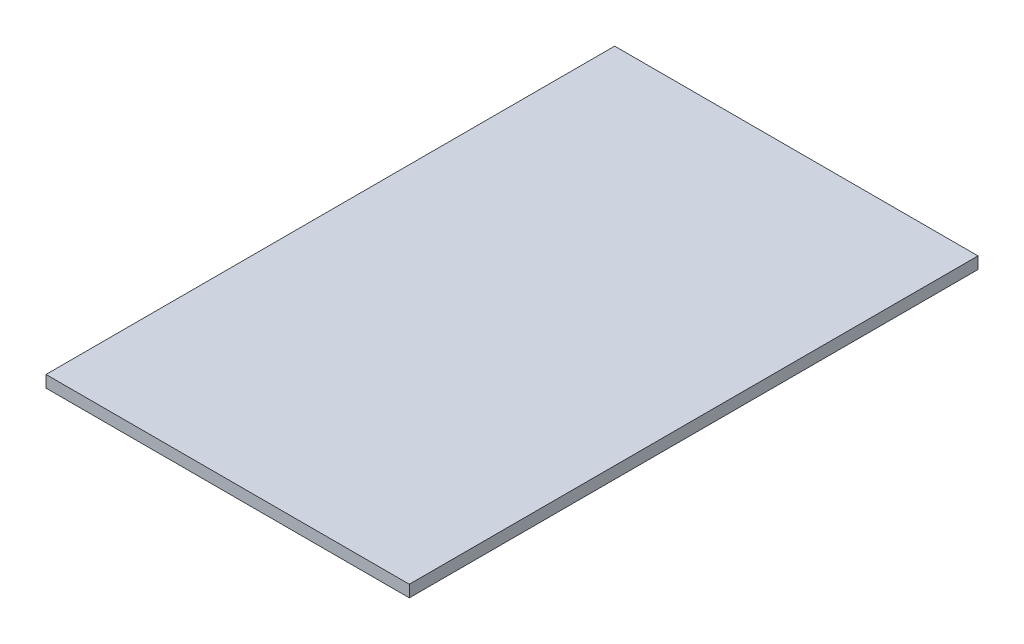
ISO-10303-21;
HEADER;
FILE_DESCRIPTION(('STEP AP214'),'2;1');
FILE_NAME('part.step','',(''),(''),'','','');
FILE_SCHEMA(('AUTOMOTIVE_DESIGN { 1 0 10303 214 1 1 1 1 }'));
ENDSEC;
DATA;
#1=APPLICATION_CONTEXT('core data for automotive mechanical design processes');
#2=APPLICATION_PROTOCOL_DEFINITION('international standard','automotive_design',2000,#1);
#3=PRODUCT_CONTEXT('',#1,'mechanical');
#4=PRODUCT('Part','Part','',(#3));
#5=PRODUCT_RELATED_PRODUCT_CATEGORY('part','',(#4));
#6=PRODUCT_DEFINITION_FORMATION('','',#4);
#7=PRODUCT_DEFINITION_CONTEXT('part definition',#1,'design');
#8=PRODUCT_DEFINITION('design','',#6,#7);
#9=PRODUCT_DEFINITION_SHAPE('','',#8);
#10=(LENGTH_UNIT() NAMED_UNIT(*) SI_UNIT(.MILLI.,.METRE.));
#11=(NAMED_UNIT(*) PLANE_ANGLE_UNIT() SI_UNIT($,.RADIAN.));
#12=(NAMED_UNIT(*) SI_UNIT($,.STERADIAN.) SOLID_ANGLE_UNIT());
#13=UNCERTAINTY_MEASURE_WITH_UNIT(LENGTH_MEASURE(1.E-05),#10,'distance_accuracy_value','');
#14=(GEOMETRIC_REPRESENTATION_CONTEXT(3) GLOBAL_UNCERTAINTY_ASSIGNED_CONTEXT((#13)) GLOBAL_UNIT_ASSIGNED_CONTEXT((#10,
#11,#12)) REPRESENTATION_CONTEXT('',''));
#15=CARTESIAN_POINT('',(0.,0.,0.));
#16=DIRECTION('',(0.,0.,1.));
#17=DIRECTION('',(1.,0.,0.));
#18=AXIS2_PLACEMENT_3D('',#15,#16,#17);
#19=CARTESIAN_POINT('',(146.05,4.7625,228.6));
#20=DIRECTION('',(-1.,0.,0.));
#21=DIRECTION('',(0.,0.,1.));
#22=AXIS2_PLACEMENT_3D('',#19,#20,#21);
#23=PLANE('',#22);
#24=DIRECTION('',(0.,0.,-1.));
#25=VECTOR('',#24,1.);
#26=CARTESIAN_POINT('',(146.05,-4.7625,228.6));
#27=LINE('',#26,#25);
#28=CARTESIAN_POINT('',(146.05,-4.7625,228.6));
#29=VERTEX_POINT('',#28);
#30=CARTESIAN_POINT('',(146.05,-4.7625,-228.6));
#31=VERTEX_POINT('',#30);
#32=EDGE_CURVE('E98',#29,#31,#27,.T.);
#33=ORIENTED_EDGE('',*,*,#32,.T.);
#34=DIRECTION('',(0.,-1.,0.));
#35=VECTOR('',#34,1.);
#36=CARTESIAN_POINT('',(146.05,4.7625,-228.6));
#37=LINE('',#36,#35);
#38=CARTESIAN_POINT('',(146.05,4.7625,-228.6));
#39=VERTEX_POINT('',#38);
#40=EDGE_CURVE('E11',#39,#31,#37,.T.);
#41=ORIENTED_EDGE('',*,*,#40,.F.);
#42=DIRECTION('',(0.,0.,-1.));
#43=VECTOR('',#42,1.);
#44=CARTESIAN_POINT('',(146.05,4.7625,228.6));
#45=LINE('',#44,#43);
#46=CARTESIAN_POINT('',(146.05,4.7625,228.6));
#47=VERTEX_POINT('',#46);
#48=EDGE_CURVE('E86',#47,#39,#45,.T.);
#49=ORIENTED_EDGE('',*,*,#48,.F.);
#50=DIRECTION('',(0.,-1.,0.));
#51=VECTOR('',#50,1.);
#52=CARTESIAN_POINT('',(146.05,4.7625,228.6));
#53=LINE('',#52,#51);
#54=EDGE_CURVE('E94',#47,#29,#53,.T.);
#55=ORIENTED_EDGE('',*,*,#54,.T.);
#56=EDGE_LOOP('',(#33,#41,#49,#55));
#57=FACE_BOUND('',#56,.T.);
#58=ADVANCED_FACE('F35',(#57),#23,.F.);
#59=CARTESIAN_POINT('',(-146.05,4.7625,-228.6));
#60=DIRECTION('',(0.,0.,1.));
#61=DIRECTION('',(1.,0.,0.));
#62=AXIS2_PLACEMENT_3D('',#59,#60,#61);
#63=PLANE('',#62);
#64=DIRECTION('',(-1.,0.,0.));
#65=VECTOR('',#64,1.);
#66=CARTESIAN_POINT('',(-146.05,-4.7625,-228.6));
#67=LINE('',#66,#65);
#68=CARTESIAN_POINT('',(-146.05,-4.7625,-228.6));
#69=VERTEX_POINT('',#68);
#70=EDGE_CURVE('E90',#31,#69,#67,.T.);
#71=ORIENTED_EDGE('',*,*,#70,.T.);
#72=DIRECTION('',(0.,-1.,0.));
#73=VECTOR('',#72,1.);
#74=CARTESIAN_POINT('',(-146.05,4.7625,-228.6));
#75=LINE('',#74,#73);
#76=CARTESIAN_POINT('',(-146.05,4.7625,-228.6));
#77=VERTEX_POINT('',#76);
#78=EDGE_CURVE('E43',#77,#69,#75,.T.);
#79=ORIENTED_EDGE('',*,*,#78,.F.);
#80=DIRECTION('',(-1.,0.,0.));
#81=VECTOR('',#80,1.);
#82=CARTESIAN_POINT('',(-146.05,4.7625,-228.6));
#83=LINE('',#82,#81);
#84=EDGE_CURVE('E81',#39,#77,#83,.T.);
#85=ORIENTED_EDGE('',*,*,#84,.F.);
#86=ORIENTED_EDGE('',*,*,#40,.T.);
#87=EDGE_LOOP('',(#71,#79,#85,#86));
#88=FACE_BOUND('',#87,.T.);
#89=ADVANCED_FACE('F89',(#88),#63,.F.);
#90=CARTESIAN_POINT('',(-146.05,4.7625,228.6));
#91=DIRECTION('',(1.,0.,0.));
#92=DIRECTION('',(0.,0.,-1.));
#93=AXIS2_PLACEMENT_3D('',#90,#91,#92);
#94=PLANE('',#93);
#95=DIRECTION('',(0.,0.,1.));
#96=VECTOR('',#95,1.);
#97=CARTESIAN_POINT('',(-146.05,-4.7625,228.6));
#98=LINE('',#97,#96);
#99=CARTESIAN_POINT('',(-146.05,-4.7625,228.6));
#100=VERTEX_POINT('',#99);
#101=EDGE_CURVE('E68',#69,#100,#98,.T.);
#102=ORIENTED_EDGE('',*,*,#101,.T.);
#103=DIRECTION('',(0.,-1.,0.));
#104=VECTOR('',#103,1.);
#105=CARTESIAN_POINT('',(-146.05,4.7625,228.6));
#106=LINE('',#105,#104);
#107=CARTESIAN_POINT('',(-146.05,4.7625,228.6));
#108=VERTEX_POINT('',#107);
#109=EDGE_CURVE('E91',#108,#100,#106,.T.);
#110=ORIENTED_EDGE('',*,*,#109,.F.);
#111=DIRECTION('',(0.,0.,1.));
#112=VECTOR('',#111,1.);
#113=CARTESIAN_POINT('',(-146.05,4.7625,228.6));
#114=LINE('',#113,#112);
#115=EDGE_CURVE('E84',#77,#108,#114,.T.);
#116=ORIENTED_EDGE('',*,*,#115,.F.);
#117=ORIENTED_EDGE('',*,*,#78,.T.);
#118=EDGE_LOOP('',(#102,#110,#116,#117));
#119=FACE_BOUND('',#118,.T.);
#120=ADVANCED_FACE('F92',(#119),#94,.F.);
#121=CARTESIAN_POINT('',(-146.05,4.7625,228.6));
#122=DIRECTION('',(0.,0.,-1.));
#123=DIRECTION('',(-1.,0.,0.));
#124=AXIS2_PLACEMENT_3D('',#121,#122,#123);
#125=PLANE('',#124);
#126=DIRECTION('',(1.,0.,0.));
#127=VECTOR('',#126,1.);
#128=CARTESIAN_POINT('',(-146.05,-4.7625,228.6));
#129=LINE('',#128,#127);
#130=EDGE_CURVE('E74',#100,#29,#129,.T.);
#131=ORIENTED_EDGE('',*,*,#130,.T.);
#132=ORIENTED_EDGE('',*,*,#54,.F.);
#133=DIRECTION('',(1.,0.,0.));
#134=VECTOR('',#133,1.);
#135=CARTESIAN_POINT('',(-146.05,4.7625,228.6));
#136=LINE('',#135,#134);
#137=EDGE_CURVE('E51',#108,#47,#136,.T.);
#138=ORIENTED_EDGE('',*,*,#137,.F.);
#139=ORIENTED_EDGE('',*,*,#109,.T.);
#140=EDGE_LOOP('',(#131,#132,#138,#139));
#141=FACE_BOUND('',#140,.T.);
#142=ADVANCED_FACE('F105',(#141),#125,.F.);
#143=CARTESIAN_POINT('',(0.,4.7625,0.));
#144=DIRECTION('',(0.,-1.,0.));
#145=DIRECTION('',(0.,0.,-1.));
#146=AXIS2_PLACEMENT_3D('',#143,#144,#145);
#147=PLANE('',#146);
#148=ORIENTED_EDGE('',*,*,#48,.T.);
#149=ORIENTED_EDGE('',*,*,#84,.T.);
#150=ORIENTED_EDGE('',*,*,#115,.T.);
#151=ORIENTED_EDGE('',*,*,#137,.T.);
#152=EDGE_LOOP('',(#148,#149,#150,#151));
#153=FACE_BOUND('',#152,.T.);
#154=ADVANCED_FACE('F82',(#153),#147,.F.);
#155=CARTESIAN_POINT('',(0.,-4.7625,0.));
#156=DIRECTION('',(0.,-1.,0.));
#157=DIRECTION('',(0.,0.,-1.));
#158=AXIS2_PLACEMENT_3D('',#155,#156,#157);
#159=PLANE('',#158);
#160=ORIENTED_EDGE('',*,*,#32,.F.);
#161=ORIENTED_EDGE('',*,*,#130,.F.);
#162=ORIENTED_EDGE('',*,*,#101,.F.);
#163=ORIENTED_EDGE('',*,*,#70,.F.);
#164=EDGE_LOOP('',(#160,#161,#162,#163));
#165=FACE_BOUND('',#164,.T.);
#166=ADVANCED_FACE('F108',(#165),#159,.T.);
#167=CLOSED_SHELL('',(#58,#89,#120,#142,#154,#166));
#168=MANIFOLD_SOLID_BREP('B2',#167);
#169=ADVANCED_BREP_SHAPE_REPRESENTATION('',(#18,#168),#14);
#170=SHAPE_DEFINITION_REPRESENTATION(#9,#169);
ENDSEC;
END-ISO-10303-21;
